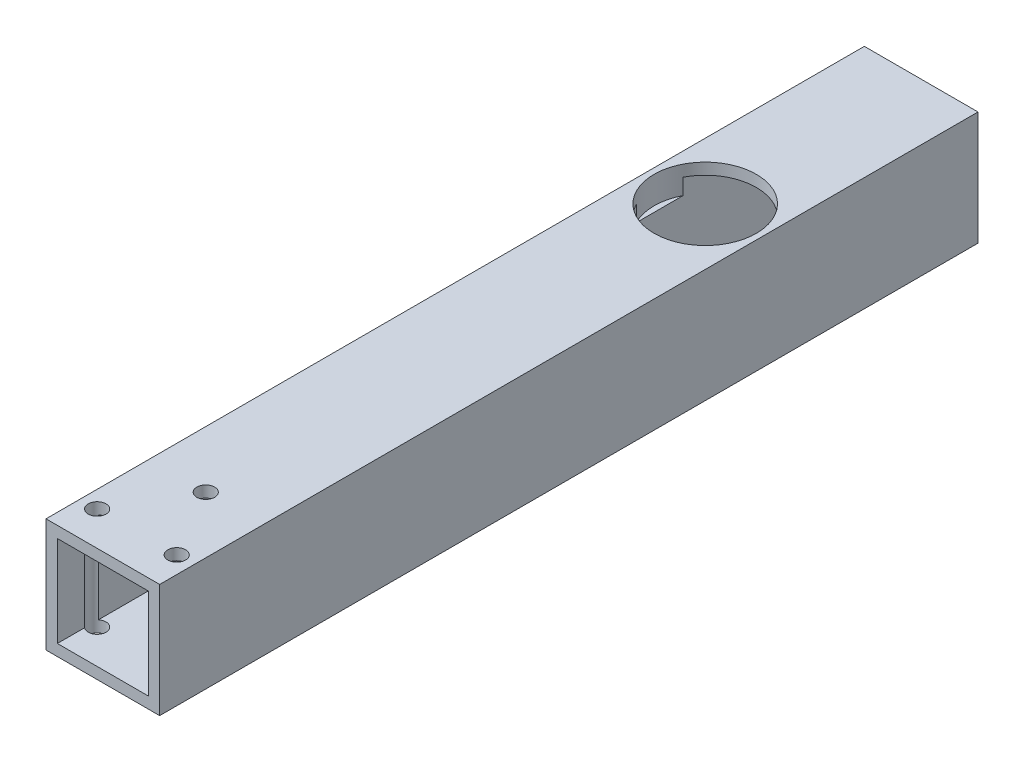
ISO-10303-21;
HEADER;
FILE_DESCRIPTION(('STEP AP214'),'2;1');
FILE_NAME('part.step','',(''),(''),'','','');
FILE_SCHEMA(('AUTOMOTIVE_DESIGN { 1 0 10303 214 1 1 1 1 }'));
ENDSEC;
DATA;
#1=APPLICATION_CONTEXT('core data for automotive mechanical design processes');
#2=APPLICATION_PROTOCOL_DEFINITION('international standard','automotive_design',2000,#1);
#3=PRODUCT_CONTEXT('',#1,'mechanical');
#4=PRODUCT('Part','Part','',(#3));
#5=PRODUCT_RELATED_PRODUCT_CATEGORY('part','',(#4));
#6=PRODUCT_DEFINITION_FORMATION('','',#4);
#7=PRODUCT_DEFINITION_CONTEXT('part definition',#1,'design');
#8=PRODUCT_DEFINITION('design','',#6,#7);
#9=PRODUCT_DEFINITION_SHAPE('','',#8);
#10=(LENGTH_UNIT() NAMED_UNIT(*) SI_UNIT(.MILLI.,.METRE.));
#11=(NAMED_UNIT(*) PLANE_ANGLE_UNIT() SI_UNIT($,.RADIAN.));
#12=(NAMED_UNIT(*) SI_UNIT($,.STERADIAN.) SOLID_ANGLE_UNIT());
#13=UNCERTAINTY_MEASURE_WITH_UNIT(LENGTH_MEASURE(1.E-05),#10,'distance_accuracy_value','');
#14=(GEOMETRIC_REPRESENTATION_CONTEXT(3) GLOBAL_UNCERTAINTY_ASSIGNED_CONTEXT((#13)) GLOBAL_UNIT_ASSIGNED_CONTEXT((#10,
#11,#12)) REPRESENTATION_CONTEXT('',''));
#15=CARTESIAN_POINT('',(0.,0.,0.));
#16=DIRECTION('',(0.,0.,1.));
#17=DIRECTION('',(1.,0.,0.));
#18=AXIS2_PLACEMENT_3D('',#15,#16,#17);
#19=CARTESIAN_POINT('',(-12.7,-12.7,114.3));
#20=DIRECTION('',(0.,1.,0.));
#21=DIRECTION('',(0.,0.,1.));
#22=AXIS2_PLACEMENT_3D('',#19,#20,#21);
#23=PLANE('',#22);
#24=CARTESIAN_POINT('',(0.,-12.7,-53.975));
#25=DIRECTION('',(0.,1.,0.));
#26=DIRECTION('',(0.,0.,1.));
#27=AXIS2_PLACEMENT_3D('',#24,#25,#26);
#28=CIRCLE('',#27,14.2875);
#29=CARTESIAN_POINT('',(12.7,-12.7,-60.520430180668));
#30=VERTEX_POINT('',#29);
#31=CARTESIAN_POINT('',(-12.7,-12.7,-60.5204301806681));
#32=VERTEX_POINT('',#31);
#33=EDGE_CURVE('E360',#30,#32,#28,.T.);
#34=ORIENTED_EDGE('',*,*,#33,.F.);
#35=DIRECTION('',(0.,0.,-1.));
#36=VECTOR('',#35,1.);
#37=CARTESIAN_POINT('',(12.7,-12.7,114.3));
#38=LINE('',#37,#36);
#39=CARTESIAN_POINT('',(12.7,-12.7,-114.3));
#40=VERTEX_POINT('',#39);
#41=EDGE_CURVE('E189',#30,#40,#38,.T.);
#42=ORIENTED_EDGE('',*,*,#41,.T.);
#43=DIRECTION('',(1.,0.,0.));
#44=VECTOR('',#43,1.);
#45=CARTESIAN_POINT('',(-12.7,-12.7,-114.3));
#46=LINE('',#45,#44);
#47=CARTESIAN_POINT('',(-12.7,-12.7,-114.3));
#48=VERTEX_POINT('',#47);
#49=EDGE_CURVE('E312',#48,#40,#46,.T.);
#50=ORIENTED_EDGE('',*,*,#49,.F.);
#51=DIRECTION('',(0.,0.,-1.));
#52=VECTOR('',#51,1.);
#53=CARTESIAN_POINT('',(-12.7,-12.7,114.3));
#54=LINE('',#53,#52);
#55=EDGE_CURVE('E206',#32,#48,#54,.T.);
#56=ORIENTED_EDGE('',*,*,#55,.F.);
#57=EDGE_LOOP('',(#34,#42,#50,#56));
#58=FACE_BOUND('',#57,.T.);
#59=ADVANCED_FACE('F37',(#58),#23,.T.);
#60=CARTESIAN_POINT('',(12.7,12.7,114.3));
#61=DIRECTION('',(0.,-1.,0.));
#62=DIRECTION('',(0.,0.,-1.));
#63=AXIS2_PLACEMENT_3D('',#60,#61,#62);
#64=PLANE('',#63);
#65=CARTESIAN_POINT('',(0.,12.7,-53.975));
#66=DIRECTION('',(0.,-1.,0.));
#67=DIRECTION('',(0.,0.,-1.));
#68=AXIS2_PLACEMENT_3D('',#65,#66,#67);
#69=CIRCLE('',#68,14.2875);
#70=CARTESIAN_POINT('',(12.7,12.7,-47.429569819332));
#71=VERTEX_POINT('',#70);
#72=CARTESIAN_POINT('',(-12.7,12.7,-47.429569819332));
#73=VERTEX_POINT('',#72);
#74=EDGE_CURVE('E255',#71,#73,#69,.T.);
#75=ORIENTED_EDGE('',*,*,#74,.F.);
#76=DIRECTION('',(0.,0.,-1.));
#77=VECTOR('',#76,1.);
#78=CARTESIAN_POINT('',(12.7,12.7,114.3));
#79=LINE('',#78,#77);
#80=CARTESIAN_POINT('',(12.7,12.7,102.85772057592));
#81=VERTEX_POINT('',#80);
#82=EDGE_CURVE('E201',#81,#71,#79,.T.);
#83=ORIENTED_EDGE('',*,*,#82,.F.);
#84=CARTESIAN_POINT('',(11.1125,12.7,104.775));
#85=DIRECTION('',(0.,-1.,0.));
#86=DIRECTION('',(0.,0.,-1.));
#87=AXIS2_PLACEMENT_3D('',#84,#85,#86);
#88=CIRCLE('',#87,2.48919999999999);
#89=CARTESIAN_POINT('',(12.7,12.7,106.69227942408));
#90=VERTEX_POINT('',#89);
#91=EDGE_CURVE('E324',#90,#81,#88,.T.);
#92=ORIENTED_EDGE('',*,*,#91,.F.);
#93=CARTESIAN_POINT('',(12.7,12.7,114.3));
#94=VERTEX_POINT('',#93);
#95=EDGE_CURVE('E196',#94,#90,#79,.T.);
#96=ORIENTED_EDGE('',*,*,#95,.F.);
#97=DIRECTION('',(-1.,0.,0.));
#98=VECTOR('',#97,1.);
#99=CARTESIAN_POINT('',(12.7,12.7,114.3));
#100=LINE('',#99,#98);
#101=CARTESIAN_POINT('',(-12.7,12.7,114.3));
#102=VERTEX_POINT('',#101);
#103=EDGE_CURVE('E286',#94,#102,#100,.T.);
#104=ORIENTED_EDGE('',*,*,#103,.T.);
#105=DIRECTION('',(0.,0.,-1.));
#106=VECTOR('',#105,1.);
#107=CARTESIAN_POINT('',(-12.7,12.7,114.3));
#108=LINE('',#107,#106);
#109=CARTESIAN_POINT('',(-12.7,12.7,106.69227942408));
#110=VERTEX_POINT('',#109);
#111=EDGE_CURVE('E283',#102,#110,#108,.T.);
#112=ORIENTED_EDGE('',*,*,#111,.T.);
#113=CARTESIAN_POINT('',(-11.1125,12.7,104.775));
#114=DIRECTION('',(0.,-1.,0.));
#115=DIRECTION('',(0.,0.,-1.));
#116=AXIS2_PLACEMENT_3D('',#113,#114,#115);
#117=CIRCLE('',#116,2.48919999999999);
#118=CARTESIAN_POINT('',(-12.7,12.7,102.85772057592));
#119=VERTEX_POINT('',#118);
#120=EDGE_CURVE('E251',#119,#110,#117,.T.);
#121=ORIENTED_EDGE('',*,*,#120,.F.);
#122=EDGE_CURVE('E276',#119,#73,#108,.T.);
#123=ORIENTED_EDGE('',*,*,#122,.T.);
#124=EDGE_LOOP('',(#75,#83,#92,#96,#104,#112,#121,#123));
#125=FACE_BOUND('',#124,.T.);
#126=CARTESIAN_POINT('',(0.,12.7,85.5472000002692));
#127=DIRECTION('',(0.,-1.,0.));
#128=DIRECTION('',(0.,0.,-1.));
#129=AXIS2_PLACEMENT_3D('',#126,#127,#128);
#130=CIRCLE('',#129,2.48919999999999);
#131=CARTESIAN_POINT('',(0.,12.7,83.0580000002692));
#132=VERTEX_POINT('',#131);
#133=EDGE_CURVE('E243',#132,#132,#130,.T.);
#134=ORIENTED_EDGE('',*,*,#133,.F.);
#135=EDGE_LOOP('',(#134));
#136=FACE_BOUND('',#135,.T.);
#137=ADVANCED_FACE('F280',(#125,#136),#64,.T.);
#138=CARTESIAN_POINT('',(-12.7,12.7,114.3));
#139=DIRECTION('',(1.,0.,0.));
#140=DIRECTION('',(0.,1.,0.));
#141=AXIS2_PLACEMENT_3D('',#138,#139,#140);
#142=PLANE('',#141);
#143=DIRECTION('',(0.,-1.,0.));
#144=VECTOR('',#143,1.);
#145=CARTESIAN_POINT('',(-12.7,-8.255,-47.4295698193319));
#146=LINE('',#145,#144);
#147=CARTESIAN_POINT('',(-12.7,-8.255,-47.429569819332));
#148=VERTEX_POINT('',#147);
#149=CARTESIAN_POINT('',(-12.7,-12.7,-47.4295698193319));
#150=VERTEX_POINT('',#149);
#151=EDGE_CURVE('E361',#148,#150,#146,.T.);
#152=ORIENTED_EDGE('',*,*,#151,.F.);
#153=DIRECTION('',(0.,0.,-1.));
#154=VECTOR('',#153,1.);
#155=CARTESIAN_POINT('',(-12.7,-8.255,114.3));
#156=LINE('',#155,#154);
#157=CARTESIAN_POINT('',(-12.7,-8.255,-60.520430180668));
#158=VERTEX_POINT('',#157);
#159=EDGE_CURVE('E183',#148,#158,#156,.T.);
#160=ORIENTED_EDGE('',*,*,#159,.T.);
#161=DIRECTION('',(0.,-1.,0.));
#162=VECTOR('',#161,1.);
#163=CARTESIAN_POINT('',(-12.7,-8.255,-60.5204301806681));
#164=LINE('',#163,#162);
#165=EDGE_CURVE('E356',#32,#158,#164,.F.);
#166=ORIENTED_EDGE('',*,*,#165,.F.);
#167=ORIENTED_EDGE('',*,*,#55,.T.);
#168=DIRECTION('',(0.,-1.,0.));
#169=VECTOR('',#168,1.);
#170=CARTESIAN_POINT('',(-12.7,12.7,-114.3));
#171=LINE('',#170,#169);
#172=CARTESIAN_POINT('',(-12.7,12.7,-114.3));
#173=VERTEX_POINT('',#172);
#174=EDGE_CURVE('E314',#173,#48,#171,.T.);
#175=ORIENTED_EDGE('',*,*,#174,.F.);
#176=CARTESIAN_POINT('',(-12.7,12.7,-60.520430180668));
#177=VERTEX_POINT('',#176);
#178=EDGE_CURVE('E284',#177,#173,#108,.T.);
#179=ORIENTED_EDGE('',*,*,#178,.F.);
#180=DIRECTION('',(0.,1.,0.));
#181=VECTOR('',#180,1.);
#182=CARTESIAN_POINT('',(-12.7,8.255,-60.520430180668));
#183=LINE('',#182,#181);
#184=CARTESIAN_POINT('',(-12.7,8.255,-60.520430180668));
#185=VERTEX_POINT('',#184);
#186=EDGE_CURVE('E59',#185,#177,#183,.T.);
#187=ORIENTED_EDGE('',*,*,#186,.F.);
#188=DIRECTION('',(0.,0.,1.));
#189=VECTOR('',#188,1.);
#190=CARTESIAN_POINT('',(-12.7,8.255,114.3));
#191=LINE('',#190,#189);
#192=CARTESIAN_POINT('',(-12.7,8.255,-47.429569819332));
#193=VERTEX_POINT('',#192);
#194=EDGE_CURVE('E277',#185,#193,#191,.T.);
#195=ORIENTED_EDGE('',*,*,#194,.T.);
#196=DIRECTION('',(0.,1.,0.));
#197=VECTOR('',#196,1.);
#198=CARTESIAN_POINT('',(-12.7,8.255,-47.429569819332));
#199=LINE('',#198,#197);
#200=EDGE_CURVE('E263',#73,#193,#199,.F.);
#201=ORIENTED_EDGE('',*,*,#200,.F.);
#202=ORIENTED_EDGE('',*,*,#122,.F.);
#203=DIRECTION('',(0.,1.,0.));
#204=VECTOR('',#203,1.);
#205=CARTESIAN_POINT('',(-12.7,15.875,102.85772057592));
#206=LINE('',#205,#204);
#207=CARTESIAN_POINT('',(-12.7,-12.7,102.85772057592));
#208=VERTEX_POINT('',#207);
#209=EDGE_CURVE('E336',#208,#119,#206,.T.);
#210=ORIENTED_EDGE('',*,*,#209,.F.);
#211=EDGE_CURVE('E210',#208,#150,#54,.T.);
#212=ORIENTED_EDGE('',*,*,#211,.T.);
#213=EDGE_LOOP('',(#152,#160,#166,#167,#175,#179,#187,#195,#201,#202,#210,#212));
#214=FACE_BOUND('',#213,.T.);
#215=ADVANCED_FACE('F274',(#214),#142,.T.);
#216=CARTESIAN_POINT('',(15.875,15.875,114.3));
#217=DIRECTION('',(0.,-1.,0.));
#218=DIRECTION('',(0.,0.,-1.));
#219=AXIS2_PLACEMENT_3D('',#216,#217,#218);
#220=PLANE('',#219);
#221=CARTESIAN_POINT('',(0.,15.875,-53.975));
#222=DIRECTION('',(0.,1.,0.));
#223=DIRECTION('',(0.,0.,1.));
#224=AXIS2_PLACEMENT_3D('',#221,#222,#223);
#225=CIRCLE('',#224,14.2875);
#226=CARTESIAN_POINT('',(0.,15.875,-39.6875));
#227=VERTEX_POINT('',#226);
#228=EDGE_CURVE('E352',#227,#227,#225,.T.);
#229=ORIENTED_EDGE('',*,*,#228,.F.);
#230=EDGE_LOOP('',(#229));
#231=FACE_BOUND('',#230,.T.);
#232=CARTESIAN_POINT('',(-11.1125,15.875,104.775));
#233=DIRECTION('',(0.,1.,0.));
#234=DIRECTION('',(0.,0.,1.));
#235=AXIS2_PLACEMENT_3D('',#232,#233,#234);
#236=CIRCLE('',#235,2.48919999999999);
#237=CARTESIAN_POINT('',(-11.1125,15.875,107.2642));
#238=VERTEX_POINT('',#237);
#239=EDGE_CURVE('E343',#238,#238,#236,.T.);
#240=ORIENTED_EDGE('',*,*,#239,.F.);
#241=EDGE_LOOP('',(#240));
#242=FACE_BOUND('',#241,.T.);
#243=CARTESIAN_POINT('',(0.,15.875,85.5472000002692));
#244=DIRECTION('',(0.,1.,0.));
#245=DIRECTION('',(0.,0.,1.));
#246=AXIS2_PLACEMENT_3D('',#243,#244,#245);
#247=CIRCLE('',#246,2.48919999999999);
#248=CARTESIAN_POINT('',(0.,15.875,88.0364000002692));
#249=VERTEX_POINT('',#248);
#250=EDGE_CURVE('E321',#249,#249,#247,.T.);
#251=ORIENTED_EDGE('',*,*,#250,.F.);
#252=EDGE_LOOP('',(#251));
#253=FACE_BOUND('',#252,.T.);
#254=DIRECTION('',(0.,0.,-1.));
#255=VECTOR('',#254,1.);
#256=CARTESIAN_POINT('',(15.875,15.875,114.3));
#257=LINE('',#256,#255);
#258=CARTESIAN_POINT('',(15.875,15.875,114.3));
#259=VERTEX_POINT('',#258);
#260=CARTESIAN_POINT('',(15.875,15.875,-114.3));
#261=VERTEX_POINT('',#260);
#262=EDGE_CURVE('E236',#259,#261,#257,.T.);
#263=ORIENTED_EDGE('',*,*,#262,.T.);
#264=DIRECTION('',(-1.,0.,0.));
#265=VECTOR('',#264,1.);
#266=CARTESIAN_POINT('',(15.875,15.875,-114.3));
#267=LINE('',#266,#265);
#268=CARTESIAN_POINT('',(-15.875,15.875,-114.3));
#269=VERTEX_POINT('',#268);
#270=EDGE_CURVE('E296',#261,#269,#267,.T.);
#271=ORIENTED_EDGE('',*,*,#270,.T.);
#272=DIRECTION('',(0.,0.,-1.));
#273=VECTOR('',#272,1.);
#274=CARTESIAN_POINT('',(-15.875,15.875,114.3));
#275=LINE('',#274,#273);
#276=CARTESIAN_POINT('',(-15.875,15.875,114.3));
#277=VERTEX_POINT('',#276);
#278=EDGE_CURVE('E234',#277,#269,#275,.T.);
#279=ORIENTED_EDGE('',*,*,#278,.F.);
#280=DIRECTION('',(-1.,0.,0.));
#281=VECTOR('',#280,1.);
#282=CARTESIAN_POINT('',(15.875,15.875,114.3));
#283=LINE('',#282,#281);
#284=EDGE_CURVE('E232',#259,#277,#283,.T.);
#285=ORIENTED_EDGE('',*,*,#284,.F.);
#286=EDGE_LOOP('',(#263,#271,#279,#285));
#287=FACE_BOUND('',#286,.T.);
#288=CARTESIAN_POINT('',(11.1125,15.875,104.775));
#289=DIRECTION('',(0.,1.,0.));
#290=DIRECTION('',(0.,0.,1.));
#291=AXIS2_PLACEMENT_3D('',#288,#289,#290);
#292=CIRCLE('',#291,2.48919999999999);
#293=CARTESIAN_POINT('',(11.1125,15.875,107.2642));
#294=VERTEX_POINT('',#293);
#295=EDGE_CURVE('E331',#294,#294,#292,.T.);
#296=ORIENTED_EDGE('',*,*,#295,.F.);
#297=EDGE_LOOP('',(#296));
#298=FACE_BOUND('',#297,.T.);
#299=ADVANCED_FACE('F415',(#231,#242,#253,#287,#298),#220,.F.);
#300=CARTESIAN_POINT('',(12.7,-12.7,114.3));
#301=DIRECTION('',(-1.,0.,0.));
#302=DIRECTION('',(0.,-1.,0.));
#303=AXIS2_PLACEMENT_3D('',#300,#301,#302);
#304=PLANE('',#303);
#305=DIRECTION('',(0.,1.,0.));
#306=VECTOR('',#305,1.);
#307=CARTESIAN_POINT('',(12.7,15.875,106.69227942408));
#308=LINE('',#307,#306);
#309=CARTESIAN_POINT('',(12.7,-12.7,106.69227942408));
#310=VERTEX_POINT('',#309);
#311=EDGE_CURVE('E249',#310,#90,#308,.T.);
#312=ORIENTED_EDGE('',*,*,#311,.F.);
#313=CARTESIAN_POINT('',(12.7,-12.7,114.3));
#314=VERTEX_POINT('',#313);
#315=EDGE_CURVE('E198',#314,#310,#38,.T.);
#316=ORIENTED_EDGE('',*,*,#315,.F.);
#317=DIRECTION('',(0.,1.,0.));
#318=VECTOR('',#317,1.);
#319=CARTESIAN_POINT('',(12.7,-12.7,114.3));
#320=LINE('',#319,#318);
#321=EDGE_CURVE('E289',#314,#94,#320,.T.);
#322=ORIENTED_EDGE('',*,*,#321,.T.);
#323=ORIENTED_EDGE('',*,*,#95,.T.);
#324=EDGE_LOOP('',(#312,#316,#322,#323));
#325=FACE_BOUND('',#324,.T.);
#326=ADVANCED_FACE('F405',(#325),#304,.T.);
#327=CARTESIAN_POINT('',(0.,0.,114.3));
#328=DIRECTION('',(0.,0.,1.));
#329=DIRECTION('',(1.,0.,0.));
#330=AXIS2_PLACEMENT_3D('',#327,#328,#329);
#331=PLANE('',#330);
#332=DIRECTION('',(0.,-1.,0.));
#333=VECTOR('',#332,1.);
#334=CARTESIAN_POINT('',(-15.875,15.875,114.3));
#335=LINE('',#334,#333);
#336=CARTESIAN_POINT('',(-15.875,-15.875,114.3));
#337=VERTEX_POINT('',#336);
#338=EDGE_CURVE('E219',#277,#337,#335,.T.);
#339=ORIENTED_EDGE('',*,*,#338,.T.);
#340=DIRECTION('',(1.,0.,0.));
#341=VECTOR('',#340,1.);
#342=CARTESIAN_POINT('',(-15.875,-15.875,114.3));
#343=LINE('',#342,#341);
#344=CARTESIAN_POINT('',(15.875,-15.875,114.3));
#345=VERTEX_POINT('',#344);
#346=EDGE_CURVE('E224',#337,#345,#343,.T.);
#347=ORIENTED_EDGE('',*,*,#346,.T.);
#348=DIRECTION('',(0.,1.,0.));
#349=VECTOR('',#348,1.);
#350=CARTESIAN_POINT('',(15.875,-15.875,114.3));
#351=LINE('',#350,#349);
#352=EDGE_CURVE('E228',#345,#259,#351,.T.);
#353=ORIENTED_EDGE('',*,*,#352,.T.);
#354=ORIENTED_EDGE('',*,*,#284,.T.);
#355=EDGE_LOOP('',(#339,#347,#353,#354));
#356=FACE_BOUND('',#355,.T.);
#357=DIRECTION('',(1.,0.,0.));
#358=VECTOR('',#357,1.);
#359=CARTESIAN_POINT('',(-12.7,-12.7,114.3));
#360=LINE('',#359,#358);
#361=CARTESIAN_POINT('',(-12.7,-12.7,114.3));
#362=VERTEX_POINT('',#361);
#363=EDGE_CURVE('E292',#362,#314,#360,.T.);
#364=ORIENTED_EDGE('',*,*,#363,.F.);
#365=DIRECTION('',(0.,-1.,0.));
#366=VECTOR('',#365,1.);
#367=CARTESIAN_POINT('',(-12.7,12.7,114.3));
#368=LINE('',#367,#366);
#369=EDGE_CURVE('E294',#102,#362,#368,.T.);
#370=ORIENTED_EDGE('',*,*,#369,.F.);
#371=ORIENTED_EDGE('',*,*,#103,.F.);
#372=ORIENTED_EDGE('',*,*,#321,.F.);
#373=EDGE_LOOP('',(#364,#370,#371,#372));
#374=FACE_BOUND('',#373,.T.);
#375=ADVANCED_FACE('F424',(#356,#374),#331,.T.);
#376=CARTESIAN_POINT('',(-15.875,15.875,114.3));
#377=DIRECTION('',(1.,0.,0.));
#378=DIRECTION('',(0.,0.,-1.));
#379=AXIS2_PLACEMENT_3D('',#376,#377,#378);
#380=PLANE('',#379);
#381=ORIENTED_EDGE('',*,*,#278,.T.);
#382=DIRECTION('',(0.,-1.,0.));
#383=VECTOR('',#382,1.);
#384=CARTESIAN_POINT('',(-15.875,15.875,-114.3));
#385=LINE('',#384,#383);
#386=CARTESIAN_POINT('',(-15.875,-15.875,-114.3));
#387=VERTEX_POINT('',#386);
#388=EDGE_CURVE('E305',#269,#387,#385,.T.);
#389=ORIENTED_EDGE('',*,*,#388,.T.);
#390=DIRECTION('',(0.,0.,-1.));
#391=VECTOR('',#390,1.);
#392=CARTESIAN_POINT('',(-15.875,-15.875,114.3));
#393=LINE('',#392,#391);
#394=EDGE_CURVE('E240',#337,#387,#393,.T.);
#395=ORIENTED_EDGE('',*,*,#394,.F.);
#396=ORIENTED_EDGE('',*,*,#338,.F.);
#397=EDGE_LOOP('',(#381,#389,#395,#396));
#398=FACE_BOUND('',#397,.T.);
#399=ADVANCED_FACE('F39',(#398),#380,.F.);
#400=CARTESIAN_POINT('',(-15.875,-15.875,114.3));
#401=DIRECTION('',(0.,1.,0.));
#402=DIRECTION('',(0.,0.,1.));
#403=AXIS2_PLACEMENT_3D('',#400,#401,#402);
#404=PLANE('',#403);
#405=CARTESIAN_POINT('',(0.,-15.875,-53.975));
#406=DIRECTION('',(0.,-1.,0.));
#407=DIRECTION('',(0.,0.,-1.));
#408=AXIS2_PLACEMENT_3D('',#405,#406,#407);
#409=CIRCLE('',#408,14.2875);
#410=CARTESIAN_POINT('',(0.,-15.875,-68.2625));
#411=VERTEX_POINT('',#410);
#412=EDGE_CURVE('E367',#411,#411,#409,.T.);
#413=ORIENTED_EDGE('',*,*,#412,.F.);
#414=EDGE_LOOP('',(#413));
#415=FACE_BOUND('',#414,.T.);
#416=CARTESIAN_POINT('',(-11.1125,-15.875,104.775));
#417=DIRECTION('',(0.,1.,0.));
#418=DIRECTION('',(0.,0.,1.));
#419=AXIS2_PLACEMENT_3D('',#416,#417,#418);
#420=CIRCLE('',#419,2.48919999999999);
#421=CARTESIAN_POINT('',(-11.1125,-15.875,107.2642));
#422=VERTEX_POINT('',#421);
#423=EDGE_CURVE('E340',#422,#422,#420,.T.);
#424=ORIENTED_EDGE('',*,*,#423,.T.);
#425=EDGE_LOOP('',(#424));
#426=FACE_BOUND('',#425,.T.);
#427=CARTESIAN_POINT('',(11.1125,-15.875,104.775));
#428=DIRECTION('',(0.,1.,0.));
#429=DIRECTION('',(0.,0.,1.));
#430=AXIS2_PLACEMENT_3D('',#427,#428,#429);
#431=CIRCLE('',#430,2.48919999999999);
#432=CARTESIAN_POINT('',(11.1125,-15.875,107.2642));
#433=VERTEX_POINT('',#432);
#434=EDGE_CURVE('E328',#433,#433,#431,.T.);
#435=ORIENTED_EDGE('',*,*,#434,.T.);
#436=EDGE_LOOP('',(#435));
#437=FACE_BOUND('',#436,.T.);
#438=CARTESIAN_POINT('',(0.,-15.875,85.5472000002692));
#439=DIRECTION('',(0.,1.,0.));
#440=DIRECTION('',(0.,0.,1.));
#441=AXIS2_PLACEMENT_3D('',#438,#439,#440);
#442=CIRCLE('',#441,2.48919999999999);
#443=CARTESIAN_POINT('',(0.,-15.875,88.0364000002692));
#444=VERTEX_POINT('',#443);
#445=EDGE_CURVE('E247',#444,#444,#442,.T.);
#446=ORIENTED_EDGE('',*,*,#445,.T.);
#447=EDGE_LOOP('',(#446));
#448=FACE_BOUND('',#447,.T.);
#449=ORIENTED_EDGE('',*,*,#394,.T.);
#450=DIRECTION('',(1.,0.,0.));
#451=VECTOR('',#450,1.);
#452=CARTESIAN_POINT('',(-15.875,-15.875,-114.3));
#453=LINE('',#452,#451);
#454=CARTESIAN_POINT('',(15.875,-15.875,-114.3));
#455=VERTEX_POINT('',#454);
#456=EDGE_CURVE('E302',#387,#455,#453,.T.);
#457=ORIENTED_EDGE('',*,*,#456,.T.);
#458=DIRECTION('',(0.,0.,-1.));
#459=VECTOR('',#458,1.);
#460=CARTESIAN_POINT('',(15.875,-15.875,114.3));
#461=LINE('',#460,#459);
#462=EDGE_CURVE('E238',#345,#455,#461,.T.);
#463=ORIENTED_EDGE('',*,*,#462,.F.);
#464=ORIENTED_EDGE('',*,*,#346,.F.);
#465=EDGE_LOOP('',(#449,#457,#463,#464));
#466=FACE_BOUND('',#465,.T.);
#467=ADVANCED_FACE('F410',(#415,#426,#437,#448,#466),#404,.F.);
#468=CARTESIAN_POINT('',(15.875,-15.875,114.3));
#469=DIRECTION('',(-1.,0.,0.));
#470=DIRECTION('',(0.,-1.,0.));
#471=AXIS2_PLACEMENT_3D('',#468,#469,#470);
#472=PLANE('',#471);
#473=ORIENTED_EDGE('',*,*,#462,.T.);
#474=DIRECTION('',(0.,1.,0.));
#475=VECTOR('',#474,1.);
#476=CARTESIAN_POINT('',(15.875,-15.875,-114.3));
#477=LINE('',#476,#475);
#478=EDGE_CURVE('E299',#455,#261,#477,.T.);
#479=ORIENTED_EDGE('',*,*,#478,.T.);
#480=ORIENTED_EDGE('',*,*,#262,.F.);
#481=ORIENTED_EDGE('',*,*,#352,.F.);
#482=EDGE_LOOP('',(#473,#479,#480,#481));
#483=FACE_BOUND('',#482,.T.);
#484=ADVANCED_FACE('F406',(#483),#472,.F.);
#485=DIRECTION('',(0.,1.,0.));
#486=VECTOR('',#485,1.);
#487=CARTESIAN_POINT('',(-12.7,15.875,106.69227942408));
#488=LINE('',#487,#486);
#489=CARTESIAN_POINT('',(-12.7,-12.7,106.69227942408));
#490=VERTEX_POINT('',#489);
#491=EDGE_CURVE('E338',#110,#490,#488,.F.);
#492=ORIENTED_EDGE('',*,*,#491,.F.);
#493=ORIENTED_EDGE('',*,*,#111,.F.);
#494=ORIENTED_EDGE('',*,*,#369,.T.);
#495=EDGE_CURVE('E211',#362,#490,#54,.T.);
#496=ORIENTED_EDGE('',*,*,#495,.T.);
#497=EDGE_LOOP('',(#492,#493,#494,#496));
#498=FACE_BOUND('',#497,.T.);
#499=ADVANCED_FACE('F400',(#498),#142,.T.);
#500=CARTESIAN_POINT('',(12.7,-12.7,-47.429569819332));
#501=VERTEX_POINT('',#500);
#502=EDGE_CURVE('E363',#150,#501,#28,.T.);
#503=ORIENTED_EDGE('',*,*,#502,.F.);
#504=ORIENTED_EDGE('',*,*,#211,.F.);
#505=CARTESIAN_POINT('',(-11.1125,-12.7,104.775));
#506=DIRECTION('',(0.,1.,0.));
#507=DIRECTION('',(0.,0.,1.));
#508=AXIS2_PLACEMENT_3D('',#505,#506,#507);
#509=CIRCLE('',#508,2.48919999999999);
#510=EDGE_CURVE('E334',#490,#208,#509,.T.);
#511=ORIENTED_EDGE('',*,*,#510,.F.);
#512=ORIENTED_EDGE('',*,*,#495,.F.);
#513=ORIENTED_EDGE('',*,*,#363,.T.);
#514=ORIENTED_EDGE('',*,*,#315,.T.);
#515=CARTESIAN_POINT('',(11.1125,-12.7,104.775));
#516=DIRECTION('',(0.,1.,0.));
#517=DIRECTION('',(0.,0.,1.));
#518=AXIS2_PLACEMENT_3D('',#515,#516,#517);
#519=CIRCLE('',#518,2.48919999999999);
#520=CARTESIAN_POINT('',(12.7,-12.7,102.85772057592));
#521=VERTEX_POINT('',#520);
#522=EDGE_CURVE('E326',#521,#310,#519,.T.);
#523=ORIENTED_EDGE('',*,*,#522,.F.);
#524=EDGE_CURVE('E195',#521,#501,#38,.T.);
#525=ORIENTED_EDGE('',*,*,#524,.T.);
#526=EDGE_LOOP('',(#503,#504,#511,#512,#513,#514,#523,#525));
#527=FACE_BOUND('',#526,.T.);
#528=CARTESIAN_POINT('',(0.,-12.7,85.5472000002692));
#529=DIRECTION('',(0.,1.,0.));
#530=DIRECTION('',(0.,0.,1.));
#531=AXIS2_PLACEMENT_3D('',#528,#529,#530);
#532=CIRCLE('',#531,2.48919999999999);
#533=CARTESIAN_POINT('',(0.,-12.7,88.0364000002692));
#534=VERTEX_POINT('',#533);
#535=EDGE_CURVE('E246',#534,#534,#532,.T.);
#536=ORIENTED_EDGE('',*,*,#535,.F.);
#537=EDGE_LOOP('',(#536));
#538=FACE_BOUND('',#537,.T.);
#539=ADVANCED_FACE('F376',(#527,#538),#23,.T.);
#540=DIRECTION('',(0.,-1.,0.));
#541=VECTOR('',#540,1.);
#542=CARTESIAN_POINT('',(12.7,-8.255,-60.520430180668));
#543=LINE('',#542,#541);
#544=CARTESIAN_POINT('',(12.7,-8.255,-60.520430180668));
#545=VERTEX_POINT('',#544);
#546=EDGE_CURVE('E11',#545,#30,#543,.T.);
#547=ORIENTED_EDGE('',*,*,#546,.F.);
#548=DIRECTION('',(0.,0.,1.));
#549=VECTOR('',#548,1.);
#550=CARTESIAN_POINT('',(12.7,-8.255,114.3));
#551=LINE('',#550,#549);
#552=CARTESIAN_POINT('',(12.7,-8.255,-47.429569819332));
#553=VERTEX_POINT('',#552);
#554=EDGE_CURVE('E172',#545,#553,#551,.T.);
#555=ORIENTED_EDGE('',*,*,#554,.T.);
#556=DIRECTION('',(0.,-1.,0.));
#557=VECTOR('',#556,1.);
#558=CARTESIAN_POINT('',(12.7,-8.255,-47.429569819332));
#559=LINE('',#558,#557);
#560=EDGE_CURVE('E45',#501,#553,#559,.F.);
#561=ORIENTED_EDGE('',*,*,#560,.F.);
#562=ORIENTED_EDGE('',*,*,#524,.F.);
#563=DIRECTION('',(0.,1.,0.));
#564=VECTOR('',#563,1.);
#565=CARTESIAN_POINT('',(12.7,15.875,102.85772057592));
#566=LINE('',#565,#564);
#567=EDGE_CURVE('E242',#81,#521,#566,.F.);
#568=ORIENTED_EDGE('',*,*,#567,.F.);
#569=ORIENTED_EDGE('',*,*,#82,.T.);
#570=DIRECTION('',(0.,1.,0.));
#571=VECTOR('',#570,1.);
#572=CARTESIAN_POINT('',(12.7,8.255,-47.429569819332));
#573=LINE('',#572,#571);
#574=CARTESIAN_POINT('',(12.7,8.255,-47.429569819332));
#575=VERTEX_POINT('',#574);
#576=EDGE_CURVE('E266',#575,#71,#573,.T.);
#577=ORIENTED_EDGE('',*,*,#576,.F.);
#578=DIRECTION('',(0.,0.,-1.));
#579=VECTOR('',#578,1.);
#580=CARTESIAN_POINT('',(12.7,8.255,114.3));
#581=LINE('',#580,#579);
#582=CARTESIAN_POINT('',(12.7,8.255,-60.520430180668));
#583=VERTEX_POINT('',#582);
#584=EDGE_CURVE('E177',#575,#583,#581,.T.);
#585=ORIENTED_EDGE('',*,*,#584,.T.);
#586=DIRECTION('',(0.,1.,0.));
#587=VECTOR('',#586,1.);
#588=CARTESIAN_POINT('',(12.7,8.255,-60.520430180668));
#589=LINE('',#588,#587);
#590=CARTESIAN_POINT('',(12.7,12.7,-60.520430180668));
#591=VERTEX_POINT('',#590);
#592=EDGE_CURVE('E349',#591,#583,#589,.F.);
#593=ORIENTED_EDGE('',*,*,#592,.F.);
#594=CARTESIAN_POINT('',(12.7,12.7,-114.3));
#595=VERTEX_POINT('',#594);
#596=EDGE_CURVE('E203',#591,#595,#79,.T.);
#597=ORIENTED_EDGE('',*,*,#596,.T.);
#598=DIRECTION('',(0.,1.,0.));
#599=VECTOR('',#598,1.);
#600=CARTESIAN_POINT('',(12.7,-12.7,-114.3));
#601=LINE('',#600,#599);
#602=EDGE_CURVE('E191',#40,#595,#601,.T.);
#603=ORIENTED_EDGE('',*,*,#602,.F.);
#604=ORIENTED_EDGE('',*,*,#41,.F.);
#605=EDGE_LOOP('',(#547,#555,#561,#562,#568,#569,#577,#585,#593,#597,#603,#604));
#606=FACE_BOUND('',#605,.T.);
#607=ADVANCED_FACE('F187',(#606),#304,.T.);
#608=EDGE_CURVE('E253',#177,#591,#69,.T.);
#609=ORIENTED_EDGE('',*,*,#608,.F.);
#610=ORIENTED_EDGE('',*,*,#178,.T.);
#611=DIRECTION('',(-1.,0.,0.));
#612=VECTOR('',#611,1.);
#613=CARTESIAN_POINT('',(12.7,12.7,-114.3));
#614=LINE('',#613,#612);
#615=EDGE_CURVE('E308',#595,#173,#614,.T.);
#616=ORIENTED_EDGE('',*,*,#615,.F.);
#617=ORIENTED_EDGE('',*,*,#596,.F.);
#618=EDGE_LOOP('',(#609,#610,#616,#617));
#619=FACE_BOUND('',#618,.T.);
#620=ADVANCED_FACE('F386',(#619),#64,.T.);
#621=CARTESIAN_POINT('',(0.,0.,-114.3));
#622=DIRECTION('',(0.,0.,1.));
#623=DIRECTION('',(1.,0.,0.));
#624=AXIS2_PLACEMENT_3D('',#621,#622,#623);
#625=PLANE('',#624);
#626=ORIENTED_EDGE('',*,*,#615,.T.);
#627=ORIENTED_EDGE('',*,*,#174,.T.);
#628=ORIENTED_EDGE('',*,*,#49,.T.);
#629=ORIENTED_EDGE('',*,*,#602,.T.);
#630=EDGE_LOOP('',(#626,#627,#628,#629));
#631=FACE_BOUND('',#630,.T.);
#632=ORIENTED_EDGE('',*,*,#388,.F.);
#633=ORIENTED_EDGE('',*,*,#270,.F.);
#634=ORIENTED_EDGE('',*,*,#478,.F.);
#635=ORIENTED_EDGE('',*,*,#456,.F.);
#636=EDGE_LOOP('',(#632,#633,#634,#635));
#637=FACE_BOUND('',#636,.T.);
#638=ADVANCED_FACE('F389',(#631,#637),#625,.F.);
#639=CARTESIAN_POINT('',(0.,15.875,85.5472000002692));
#640=DIRECTION('',(0.,1.,0.));
#641=DIRECTION('',(0.,0.,1.));
#642=AXIS2_PLACEMENT_3D('',#639,#640,#641);
#643=CYLINDRICAL_SURFACE('',#642,2.48919999999999);
#644=ORIENTED_EDGE('',*,*,#133,.T.);
#645=EDGE_LOOP('',(#644));
#646=FACE_BOUND('',#645,.T.);
#647=ORIENTED_EDGE('',*,*,#250,.T.);
#648=EDGE_LOOP('',(#647));
#649=FACE_BOUND('',#648,.T.);
#650=ADVANCED_FACE('F474',(#646,#649),#643,.F.);
#651=ORIENTED_EDGE('',*,*,#535,.T.);
#652=EDGE_LOOP('',(#651));
#653=FACE_BOUND('',#652,.T.);
#654=ORIENTED_EDGE('',*,*,#445,.F.);
#655=EDGE_LOOP('',(#654));
#656=FACE_BOUND('',#655,.T.);
#657=ADVANCED_FACE('F463',(#653,#656),#643,.F.);
#658=CARTESIAN_POINT('',(11.1125,15.875,104.775));
#659=DIRECTION('',(0.,1.,0.));
#660=DIRECTION('',(0.,0.,1.));
#661=AXIS2_PLACEMENT_3D('',#658,#659,#660);
#662=CYLINDRICAL_SURFACE('',#661,2.48919999999999);
#663=ORIENTED_EDGE('',*,*,#311,.T.);
#664=ORIENTED_EDGE('',*,*,#91,.T.);
#665=ORIENTED_EDGE('',*,*,#567,.T.);
#666=ORIENTED_EDGE('',*,*,#522,.T.);
#667=EDGE_LOOP('',(#663,#664,#665,#666));
#668=FACE_BOUND('',#667,.T.);
#669=ORIENTED_EDGE('',*,*,#434,.F.);
#670=EDGE_LOOP('',(#669));
#671=FACE_BOUND('',#670,.T.);
#672=ORIENTED_EDGE('',*,*,#295,.T.);
#673=EDGE_LOOP('',(#672));
#674=FACE_BOUND('',#673,.T.);
#675=ADVANCED_FACE('F459',(#668,#671,#674),#662,.F.);
#676=CARTESIAN_POINT('',(-11.1125,15.875,104.775));
#677=DIRECTION('',(0.,1.,0.));
#678=DIRECTION('',(0.,0.,1.));
#679=AXIS2_PLACEMENT_3D('',#676,#677,#678);
#680=CYLINDRICAL_SURFACE('',#679,2.48919999999999);
#681=ORIENTED_EDGE('',*,*,#510,.T.);
#682=ORIENTED_EDGE('',*,*,#209,.T.);
#683=ORIENTED_EDGE('',*,*,#120,.T.);
#684=ORIENTED_EDGE('',*,*,#491,.T.);
#685=EDGE_LOOP('',(#681,#682,#683,#684));
#686=FACE_BOUND('',#685,.T.);
#687=ORIENTED_EDGE('',*,*,#423,.F.);
#688=EDGE_LOOP('',(#687));
#689=FACE_BOUND('',#688,.T.);
#690=ORIENTED_EDGE('',*,*,#239,.T.);
#691=EDGE_LOOP('',(#690));
#692=FACE_BOUND('',#691,.T.);
#693=ADVANCED_FACE('F462',(#686,#689,#692),#680,.F.);
#694=CARTESIAN_POINT('',(0.,8.255,-53.975));
#695=DIRECTION('',(0.,1.,0.));
#696=DIRECTION('',(0.,0.,1.));
#697=AXIS2_PLACEMENT_3D('',#694,#695,#696);
#698=PLANE('',#697);
#699=CARTESIAN_POINT('',(0.,8.255,-53.975));
#700=DIRECTION('',(0.,1.,0.));
#701=DIRECTION('',(0.,0.,1.));
#702=AXIS2_PLACEMENT_3D('',#699,#700,#701);
#703=CIRCLE('',#702,14.2875);
#704=EDGE_CURVE('E355',#185,#193,#703,.T.);
#705=ORIENTED_EDGE('',*,*,#704,.T.);
#706=ORIENTED_EDGE('',*,*,#194,.F.);
#707=EDGE_LOOP('',(#705,#706));
#708=FACE_BOUND('',#707,.T.);
#709=ADVANCED_FACE('F471',(#708),#698,.T.);
#710=CARTESIAN_POINT('',(0.,8.255,-53.975));
#711=DIRECTION('',(0.,1.,0.));
#712=DIRECTION('',(0.,0.,1.));
#713=AXIS2_PLACEMENT_3D('',#710,#711,#712);
#714=CYLINDRICAL_SURFACE('',#713,14.2875);
#715=ORIENTED_EDGE('',*,*,#200,.T.);
#716=ORIENTED_EDGE('',*,*,#704,.F.);
#717=ORIENTED_EDGE('',*,*,#186,.T.);
#718=ORIENTED_EDGE('',*,*,#608,.T.);
#719=ORIENTED_EDGE('',*,*,#592,.T.);
#720=EDGE_CURVE('E351',#575,#583,#703,.T.);
#721=ORIENTED_EDGE('',*,*,#720,.F.);
#722=ORIENTED_EDGE('',*,*,#576,.T.);
#723=ORIENTED_EDGE('',*,*,#74,.T.);
#724=EDGE_LOOP('',(#715,#716,#717,#718,#719,#721,#722,#723));
#725=FACE_BOUND('',#724,.T.);
#726=ORIENTED_EDGE('',*,*,#228,.T.);
#727=EDGE_LOOP('',(#726));
#728=FACE_BOUND('',#727,.T.);
#729=ADVANCED_FACE('F261',(#725,#728),#714,.F.);
#730=ORIENTED_EDGE('',*,*,#720,.T.);
#731=ORIENTED_EDGE('',*,*,#584,.F.);
#732=EDGE_LOOP('',(#730,#731));
#733=FACE_BOUND('',#732,.T.);
#734=ADVANCED_FACE('F576',(#733),#698,.T.);
#735=CARTESIAN_POINT('',(0.,-8.255,-53.975));
#736=DIRECTION('',(0.,-1.,0.));
#737=DIRECTION('',(0.,0.,-1.));
#738=AXIS2_PLACEMENT_3D('',#735,#736,#737);
#739=PLANE('',#738);
#740=CARTESIAN_POINT('',(0.,-8.255,-53.975));
#741=DIRECTION('',(0.,-1.,0.));
#742=DIRECTION('',(0.,0.,-1.));
#743=AXIS2_PLACEMENT_3D('',#740,#741,#742);
#744=CIRCLE('',#743,14.2875);
#745=EDGE_CURVE('E184',#148,#158,#744,.T.);
#746=ORIENTED_EDGE('',*,*,#745,.T.);
#747=ORIENTED_EDGE('',*,*,#159,.F.);
#748=EDGE_LOOP('',(#746,#747));
#749=FACE_BOUND('',#748,.T.);
#750=ADVANCED_FACE('F373',(#749),#739,.T.);
#751=CARTESIAN_POINT('',(0.,-8.255,-53.975));
#752=DIRECTION('',(0.,-1.,0.));
#753=DIRECTION('',(0.,0.,-1.));
#754=AXIS2_PLACEMENT_3D('',#751,#752,#753);
#755=CYLINDRICAL_SURFACE('',#754,14.2875);
#756=ORIENTED_EDGE('',*,*,#165,.T.);
#757=ORIENTED_EDGE('',*,*,#745,.F.);
#758=ORIENTED_EDGE('',*,*,#151,.T.);
#759=ORIENTED_EDGE('',*,*,#502,.T.);
#760=ORIENTED_EDGE('',*,*,#560,.T.);
#761=EDGE_CURVE('E51',#545,#553,#744,.T.);
#762=ORIENTED_EDGE('',*,*,#761,.F.);
#763=ORIENTED_EDGE('',*,*,#546,.T.);
#764=ORIENTED_EDGE('',*,*,#33,.T.);
#765=EDGE_LOOP('',(#756,#757,#758,#759,#760,#762,#763,#764));
#766=FACE_BOUND('',#765,.T.);
#767=ORIENTED_EDGE('',*,*,#412,.T.);
#768=EDGE_LOOP('',(#767));
#769=FACE_BOUND('',#768,.T.);
#770=ADVANCED_FACE('F180',(#766,#769),#755,.F.);
#771=ORIENTED_EDGE('',*,*,#761,.T.);
#772=ORIENTED_EDGE('',*,*,#554,.F.);
#773=EDGE_LOOP('',(#771,#772));
#774=FACE_BOUND('',#773,.T.);
#775=ADVANCED_FACE('F173',(#774),#739,.T.);
#776=CLOSED_SHELL('',(#59,#137,#215,#299,#326,#375,#399,#467,#484,#499,#539,#607,#620,#638,#650,
#657,#675,#693,#709,#729,#734,#750,#770,#775));
#777=MANIFOLD_SOLID_BREP('B2',#776);
#778=ADVANCED_BREP_SHAPE_REPRESENTATION('',(#18,#777),#14);
#779=SHAPE_DEFINITION_REPRESENTATION(#9,#778);
ENDSEC;
END-ISO-10303-21;
